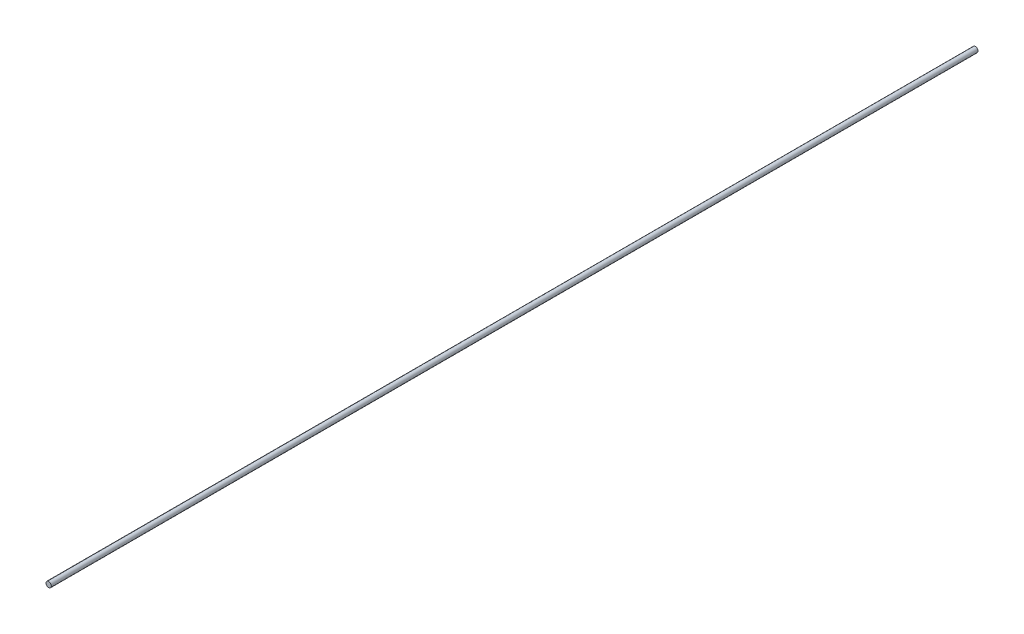
ISO-10303-21;
HEADER;
FILE_DESCRIPTION(('STEP AP214'),'2;1');
FILE_NAME('part.step','',(''),(''),'','','');
FILE_SCHEMA(('AUTOMOTIVE_DESIGN { 1 0 10303 214 1 1 1 1 }'));
ENDSEC;
DATA;
#1=APPLICATION_CONTEXT('core data for automotive mechanical design processes');
#2=APPLICATION_PROTOCOL_DEFINITION('international standard','automotive_design',2000,#1);
#3=PRODUCT_CONTEXT('',#1,'mechanical');
#4=PRODUCT('Part','Part','',(#3));
#5=PRODUCT_RELATED_PRODUCT_CATEGORY('part','',(#4));
#6=PRODUCT_DEFINITION_FORMATION('','',#4);
#7=PRODUCT_DEFINITION_CONTEXT('part definition',#1,'design');
#8=PRODUCT_DEFINITION('design','',#6,#7);
#9=PRODUCT_DEFINITION_SHAPE('','',#8);
#10=(LENGTH_UNIT() NAMED_UNIT(*) SI_UNIT(.MILLI.,.METRE.));
#11=(NAMED_UNIT(*) PLANE_ANGLE_UNIT() SI_UNIT($,.RADIAN.));
#12=(NAMED_UNIT(*) SI_UNIT($,.STERADIAN.) SOLID_ANGLE_UNIT());
#13=UNCERTAINTY_MEASURE_WITH_UNIT(LENGTH_MEASURE(1.E-05),#10,'distance_accuracy_value','');
#14=(GEOMETRIC_REPRESENTATION_CONTEXT(3) GLOBAL_UNCERTAINTY_ASSIGNED_CONTEXT((#13)) GLOBAL_UNIT_ASSIGNED_CONTEXT((#10,
#11,#12)) REPRESENTATION_CONTEXT('',''));
#15=CARTESIAN_POINT('',(0.,0.,0.));
#16=DIRECTION('',(0.,0.,1.));
#17=DIRECTION('',(1.,0.,0.));
#18=AXIS2_PLACEMENT_3D('',#15,#16,#17);
#19=CARTESIAN_POINT('',(0.,0.,1104.9));
#20=DIRECTION('',(0.,0.,-1.));
#21=DIRECTION('',(-1.,0.,0.));
#22=AXIS2_PLACEMENT_3D('',#19,#20,#21);
#23=CYLINDRICAL_SURFACE('',#22,3.175);
#24=CARTESIAN_POINT('',(0.,0.,1104.9));
#25=DIRECTION('',(0.,0.,1.));
#26=DIRECTION('',(1.,0.,0.));
#27=AXIS2_PLACEMENT_3D('',#24,#25,#26);
#28=CIRCLE('',#27,3.175);
#29=CARTESIAN_POINT('',(3.175,0.,1104.9));
#30=VERTEX_POINT('',#29);
#31=EDGE_CURVE('E10',#30,#30,#28,.T.);
#32=ORIENTED_EDGE('',*,*,#31,.F.);
#33=EDGE_LOOP('',(#32));
#34=FACE_BOUND('',#33,.T.);
#35=CARTESIAN_POINT('',(0.,0.,0.));
#36=DIRECTION('',(0.,0.,1.));
#37=DIRECTION('',(1.,0.,0.));
#38=AXIS2_PLACEMENT_3D('',#35,#36,#37);
#39=CIRCLE('',#38,3.175);
#40=CARTESIAN_POINT('',(3.175,0.,0.));
#41=VERTEX_POINT('',#40);
#42=EDGE_CURVE('E42',#41,#41,#39,.T.);
#43=ORIENTED_EDGE('',*,*,#42,.T.);
#44=EDGE_LOOP('',(#43));
#45=FACE_BOUND('',#44,.T.);
#46=ADVANCED_FACE('F39',(#34,#45),#23,.T.);
#47=CARTESIAN_POINT('',(0.,0.,1104.9));
#48=DIRECTION('',(0.,0.,1.));
#49=DIRECTION('',(1.,0.,0.));
#50=AXIS2_PLACEMENT_3D('',#47,#48,#49);
#51=PLANE('',#50);
#52=ORIENTED_EDGE('',*,*,#31,.T.);
#53=EDGE_LOOP('',(#52));
#54=FACE_BOUND('',#53,.T.);
#55=ADVANCED_FACE('F54',(#54),#51,.T.);
#56=CARTESIAN_POINT('',(0.,0.,0.));
#57=DIRECTION('',(0.,0.,1.));
#58=DIRECTION('',(1.,0.,0.));
#59=AXIS2_PLACEMENT_3D('',#56,#57,#58);
#60=PLANE('',#59);
#61=ORIENTED_EDGE('',*,*,#42,.F.);
#62=EDGE_LOOP('',(#61));
#63=FACE_BOUND('',#62,.T.);
#64=ADVANCED_FACE('F52',(#63),#60,.F.);
#65=CLOSED_SHELL('',(#46,#55,#64));
#66=MANIFOLD_SOLID_BREP('B2',#65);
#67=ADVANCED_BREP_SHAPE_REPRESENTATION('',(#18,#66),#14);
#68=SHAPE_DEFINITION_REPRESENTATION(#9,#67);
ENDSEC;
END-ISO-10303-21;
